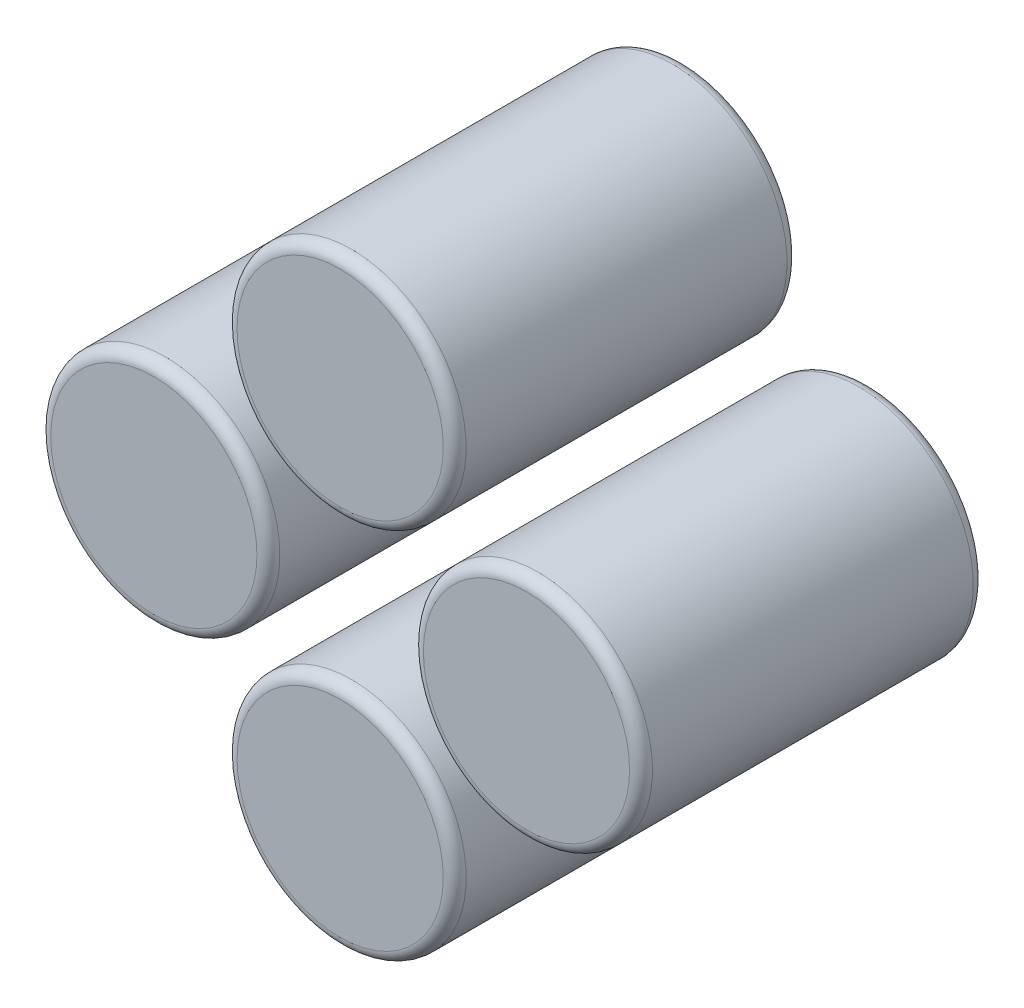
ISO-10303-21;
HEADER;
FILE_DESCRIPTION(('STEP AP214'),'2;1');
FILE_NAME('part.step','',(''),(''),'','','');
FILE_SCHEMA(('AUTOMOTIVE_DESIGN { 1 0 10303 214 1 1 1 1 }'));
ENDSEC;
DATA;
#1=APPLICATION_CONTEXT('core data for automotive mechanical design processes');
#2=APPLICATION_PROTOCOL_DEFINITION('international standard','automotive_design',2000,#1);
#3=PRODUCT_CONTEXT('',#1,'mechanical');
#4=PRODUCT('Part','Part','',(#3));
#5=PRODUCT_RELATED_PRODUCT_CATEGORY('part','',(#4));
#6=PRODUCT_DEFINITION_FORMATION('','',#4);
#7=PRODUCT_DEFINITION_CONTEXT('part definition',#1,'design');
#8=PRODUCT_DEFINITION('design','',#6,#7);
#9=PRODUCT_DEFINITION_SHAPE('','',#8);
#10=(LENGTH_UNIT() NAMED_UNIT(*) SI_UNIT(.MILLI.,.METRE.));
#11=(NAMED_UNIT(*) PLANE_ANGLE_UNIT() SI_UNIT($,.RADIAN.));
#12=(NAMED_UNIT(*) SI_UNIT($,.STERADIAN.) SOLID_ANGLE_UNIT());
#13=UNCERTAINTY_MEASURE_WITH_UNIT(LENGTH_MEASURE(1.E-05),#10,'distance_accuracy_value','');
#14=(GEOMETRIC_REPRESENTATION_CONTEXT(3) GLOBAL_UNCERTAINTY_ASSIGNED_CONTEXT((#13)) GLOBAL_UNIT_ASSIGNED_CONTEXT((#10,
#11,#12)) REPRESENTATION_CONTEXT('',''));
#15=CARTESIAN_POINT('',(0.,0.,0.));
#16=DIRECTION('',(0.,0.,1.));
#17=DIRECTION('',(1.,0.,0.));
#18=AXIS2_PLACEMENT_3D('',#15,#16,#17);
#19=CARTESIAN_POINT('',(8.13172798364529,0.,-7.49999999999999));
#20=DIRECTION('',(0.,0.,1.));
#21=DIRECTION('',(1.,0.,0.));
#22=AXIS2_PLACEMENT_3D('',#19,#20,#21);
#23=CYLINDRICAL_SURFACE('',#22,5.);
#24=CARTESIAN_POINT('',(8.13172798364529,0.,7.00000000000001));
#25=DIRECTION('',(0.,0.,-1.));
#26=DIRECTION('',(-1.,0.,0.));
#27=AXIS2_PLACEMENT_3D('',#24,#25,#26);
#28=CIRCLE('',#27,5.);
#29=CARTESIAN_POINT('',(3.1317279836453,0.,7.00000000000001));
#30=VERTEX_POINT('',#29);
#31=EDGE_CURVE('E57',#30,#30,#28,.T.);
#32=ORIENTED_EDGE('',*,*,#31,.T.);
#33=EDGE_LOOP('',(#32));
#34=FACE_BOUND('',#33,.T.);
#35=CARTESIAN_POINT('',(8.13172798364529,0.,-6.99999999999999));
#36=DIRECTION('',(0.,0.,-1.));
#37=DIRECTION('',(-1.,0.,0.));
#38=AXIS2_PLACEMENT_3D('',#35,#36,#37);
#39=CIRCLE('',#38,5.);
#40=CARTESIAN_POINT('',(3.1317279836453,0.,-6.99999999999999));
#41=VERTEX_POINT('',#40);
#42=EDGE_CURVE('E61',#41,#41,#39,.F.);
#43=ORIENTED_EDGE('',*,*,#42,.T.);
#44=EDGE_LOOP('',(#43));
#45=FACE_BOUND('',#44,.T.);
#46=ADVANCED_FACE('F46',(#34,#45),#23,.T.);
#47=CARTESIAN_POINT('',(8.13172798364529,0.,-7.49999999999999));
#48=DIRECTION('',(0.,0.,-1.));
#49=DIRECTION('',(-1.,0.,0.));
#50=AXIS2_PLACEMENT_3D('',#47,#48,#49);
#51=PLANE('',#50);
#52=CARTESIAN_POINT('',(8.13172798364529,0.,-7.49999999999999));
#53=DIRECTION('',(0.,0.,-1.));
#54=DIRECTION('',(-1.,0.,0.));
#55=AXIS2_PLACEMENT_3D('',#52,#53,#54);
#56=CIRCLE('',#55,4.5);
#57=CARTESIAN_POINT('',(3.6317279836453,0.,-7.49999999999999));
#58=VERTEX_POINT('',#57);
#59=EDGE_CURVE('E11',#58,#58,#56,.T.);
#60=ORIENTED_EDGE('',*,*,#59,.T.);
#61=EDGE_LOOP('',(#60));
#62=FACE_BOUND('',#61,.T.);
#63=ADVANCED_FACE('F77',(#62),#51,.T.);
#64=CARTESIAN_POINT('',(8.13172798364529,0.,7.50000000000001));
#65=DIRECTION('',(0.,0.,-1.));
#66=DIRECTION('',(-1.,0.,0.));
#67=AXIS2_PLACEMENT_3D('',#64,#65,#66);
#68=PLANE('',#67);
#69=CARTESIAN_POINT('',(8.13172798364529,0.,7.50000000000001));
#70=DIRECTION('',(0.,0.,-1.));
#71=DIRECTION('',(-1.,0.,0.));
#72=AXIS2_PLACEMENT_3D('',#69,#70,#71);
#73=CIRCLE('',#72,4.5);
#74=CARTESIAN_POINT('',(3.6317279836453,0.,7.50000000000001));
#75=VERTEX_POINT('',#74);
#76=EDGE_CURVE('E53',#75,#75,#73,.F.);
#77=ORIENTED_EDGE('',*,*,#76,.T.);
#78=EDGE_LOOP('',(#77));
#79=FACE_BOUND('',#78,.T.);
#80=ADVANCED_FACE('F74',(#79),#68,.F.);
#81=CARTESIAN_POINT('',(8.13172798364529,0.,7.00000000000001));
#82=DIRECTION('',(0.,0.,-1.));
#83=DIRECTION('',(-1.,0.,0.));
#84=AXIS2_PLACEMENT_3D('',#81,#82,#83);
#85=TOROIDAL_SURFACE('',#84,4.5,0.5);
#86=ORIENTED_EDGE('',*,*,#76,.F.);
#87=EDGE_LOOP('',(#86));
#88=FACE_BOUND('',#87,.T.);
#89=ORIENTED_EDGE('',*,*,#31,.F.);
#90=EDGE_LOOP('',(#89));
#91=FACE_BOUND('',#90,.T.);
#92=ADVANCED_FACE('F70',(#88,#91),#85,.T.);
#93=CARTESIAN_POINT('',(8.13172798364529,0.,-6.99999999999999));
#94=DIRECTION('',(0.,0.,-1.));
#95=DIRECTION('',(-1.,0.,0.));
#96=AXIS2_PLACEMENT_3D('',#93,#94,#95);
#97=TOROIDAL_SURFACE('',#96,4.5,0.5);
#98=ORIENTED_EDGE('',*,*,#42,.F.);
#99=EDGE_LOOP('',(#98));
#100=FACE_BOUND('',#99,.T.);
#101=ORIENTED_EDGE('',*,*,#59,.F.);
#102=EDGE_LOOP('',(#101));
#103=FACE_BOUND('',#102,.T.);
#104=ADVANCED_FACE('F48',(#100,#103),#97,.T.);
#105=CLOSED_SHELL('',(#46,#63,#80,#92,#104));
#106=MANIFOLD_SOLID_BREP('B2',#105);
#107=CARTESIAN_POINT('',(0.,8.13172798364529,-7.49999999999999));
#108=DIRECTION('',(0.,0.,1.));
#109=DIRECTION('',(1.,0.,0.));
#110=AXIS2_PLACEMENT_3D('',#107,#108,#109);
#111=CYLINDRICAL_SURFACE('',#110,5.);
#112=CARTESIAN_POINT('',(0.,8.13172798364529,7.00000000000001));
#113=DIRECTION('',(0.,0.,-1.));
#114=DIRECTION('',(-1.,0.,0.));
#115=AXIS2_PLACEMENT_3D('',#112,#113,#114);
#116=CIRCLE('',#115,5.);
#117=CARTESIAN_POINT('',(-5.,8.13172798364529,7.00000000000001));
#118=VERTEX_POINT('',#117);
#119=EDGE_CURVE('E136',#118,#118,#116,.T.);
#120=ORIENTED_EDGE('',*,*,#119,.T.);
#121=EDGE_LOOP('',(#120));
#122=FACE_BOUND('',#121,.T.);
#123=CARTESIAN_POINT('',(0.,8.13172798364529,-6.99999999999999));
#124=DIRECTION('',(0.,0.,-1.));
#125=DIRECTION('',(-1.,0.,0.));
#126=AXIS2_PLACEMENT_3D('',#123,#124,#125);
#127=CIRCLE('',#126,5.);
#128=CARTESIAN_POINT('',(-5.,8.13172798364529,-6.99999999999999));
#129=VERTEX_POINT('',#128);
#130=EDGE_CURVE('E140',#129,#129,#127,.F.);
#131=ORIENTED_EDGE('',*,*,#130,.T.);
#132=EDGE_LOOP('',(#131));
#133=FACE_BOUND('',#132,.T.);
#134=ADVANCED_FACE('F125',(#122,#133),#111,.T.);
#135=CARTESIAN_POINT('',(0.,8.13172798364529,-7.49999999999999));
#136=DIRECTION('',(0.,0.,-1.));
#137=DIRECTION('',(-1.,0.,0.));
#138=AXIS2_PLACEMENT_3D('',#135,#136,#137);
#139=PLANE('',#138);
#140=CARTESIAN_POINT('',(0.,8.13172798364529,-7.49999999999999));
#141=DIRECTION('',(0.,0.,-1.));
#142=DIRECTION('',(-1.,0.,0.));
#143=AXIS2_PLACEMENT_3D('',#140,#141,#142);
#144=CIRCLE('',#143,4.5);
#145=CARTESIAN_POINT('',(-4.5,8.13172798364529,-7.49999999999999));
#146=VERTEX_POINT('',#145);
#147=EDGE_CURVE('E45',#146,#146,#144,.T.);
#148=ORIENTED_EDGE('',*,*,#147,.T.);
#149=EDGE_LOOP('',(#148));
#150=FACE_BOUND('',#149,.T.);
#151=ADVANCED_FACE('F156',(#150),#139,.T.);
#152=CARTESIAN_POINT('',(0.,8.13172798364529,7.50000000000001));
#153=DIRECTION('',(0.,0.,-1.));
#154=DIRECTION('',(-1.,0.,0.));
#155=AXIS2_PLACEMENT_3D('',#152,#153,#154);
#156=PLANE('',#155);
#157=CARTESIAN_POINT('',(0.,8.13172798364529,7.50000000000001));
#158=DIRECTION('',(0.,0.,-1.));
#159=DIRECTION('',(-1.,0.,0.));
#160=AXIS2_PLACEMENT_3D('',#157,#158,#159);
#161=CIRCLE('',#160,4.5);
#162=CARTESIAN_POINT('',(-4.5,8.13172798364529,7.50000000000001));
#163=VERTEX_POINT('',#162);
#164=EDGE_CURVE('E132',#163,#163,#161,.F.);
#165=ORIENTED_EDGE('',*,*,#164,.T.);
#166=EDGE_LOOP('',(#165));
#167=FACE_BOUND('',#166,.T.);
#168=ADVANCED_FACE('F153',(#167),#156,.F.);
#169=CARTESIAN_POINT('',(0.,8.13172798364529,7.00000000000001));
#170=DIRECTION('',(0.,0.,-1.));
#171=DIRECTION('',(-1.,0.,0.));
#172=AXIS2_PLACEMENT_3D('',#169,#170,#171);
#173=TOROIDAL_SURFACE('',#172,4.5,0.5);
#174=ORIENTED_EDGE('',*,*,#164,.F.);
#175=EDGE_LOOP('',(#174));
#176=FACE_BOUND('',#175,.T.);
#177=ORIENTED_EDGE('',*,*,#119,.F.);
#178=EDGE_LOOP('',(#177));
#179=FACE_BOUND('',#178,.T.);
#180=ADVANCED_FACE('F149',(#176,#179),#173,.T.);
#181=CARTESIAN_POINT('',(0.,8.13172798364529,-6.99999999999999));
#182=DIRECTION('',(0.,0.,-1.));
#183=DIRECTION('',(-1.,0.,0.));
#184=AXIS2_PLACEMENT_3D('',#181,#182,#183);
#185=TOROIDAL_SURFACE('',#184,4.5,0.5);
#186=ORIENTED_EDGE('',*,*,#130,.F.);
#187=EDGE_LOOP('',(#186));
#188=FACE_BOUND('',#187,.T.);
#189=ORIENTED_EDGE('',*,*,#147,.F.);
#190=EDGE_LOOP('',(#189));
#191=FACE_BOUND('',#190,.T.);
#192=ADVANCED_FACE('F127',(#188,#191),#185,.T.);
#193=CLOSED_SHELL('',(#134,#151,#168,#180,#192));
#194=MANIFOLD_SOLID_BREP('B6',#193);
#195=CARTESIAN_POINT('',(0.,-8.13172798364529,-7.49999999999999));
#196=DIRECTION('',(0.,0.,1.));
#197=DIRECTION('',(1.,0.,0.));
#198=AXIS2_PLACEMENT_3D('',#195,#196,#197);
#199=CYLINDRICAL_SURFACE('',#198,5.);
#200=CARTESIAN_POINT('',(0.,-8.13172798364529,7.00000000000001));
#201=DIRECTION('',(0.,0.,-1.));
#202=DIRECTION('',(-1.,0.,0.));
#203=AXIS2_PLACEMENT_3D('',#200,#201,#202);
#204=CIRCLE('',#203,5.);
#205=CARTESIAN_POINT('',(-4.99999999999999,-8.13172798364529,7.00000000000001));
#206=VERTEX_POINT('',#205);
#207=EDGE_CURVE('E214',#206,#206,#204,.T.);
#208=ORIENTED_EDGE('',*,*,#207,.T.);
#209=EDGE_LOOP('',(#208));
#210=FACE_BOUND('',#209,.T.);
#211=CARTESIAN_POINT('',(0.,-8.13172798364529,-6.99999999999999));
#212=DIRECTION('',(0.,0.,-1.));
#213=DIRECTION('',(-1.,0.,0.));
#214=AXIS2_PLACEMENT_3D('',#211,#212,#213);
#215=CIRCLE('',#214,5.);
#216=CARTESIAN_POINT('',(-4.99999999999999,-8.13172798364529,-6.99999999999999));
#217=VERTEX_POINT('',#216);
#218=EDGE_CURVE('E218',#217,#217,#215,.F.);
#219=ORIENTED_EDGE('',*,*,#218,.T.);
#220=EDGE_LOOP('',(#219));
#221=FACE_BOUND('',#220,.T.);
#222=ADVANCED_FACE('F203',(#210,#221),#199,.T.);
#223=CARTESIAN_POINT('',(0.,-8.13172798364529,-7.49999999999999));
#224=DIRECTION('',(0.,0.,-1.));
#225=DIRECTION('',(-1.,0.,0.));
#226=AXIS2_PLACEMENT_3D('',#223,#224,#225);
#227=PLANE('',#226);
#228=CARTESIAN_POINT('',(0.,-8.13172798364529,-7.49999999999999));
#229=DIRECTION('',(0.,0.,-1.));
#230=DIRECTION('',(-1.,0.,0.));
#231=AXIS2_PLACEMENT_3D('',#228,#229,#230);
#232=CIRCLE('',#231,4.5);
#233=CARTESIAN_POINT('',(-4.49999999999999,-8.13172798364529,-7.49999999999999));
#234=VERTEX_POINT('',#233);
#235=EDGE_CURVE('E124',#234,#234,#232,.T.);
#236=ORIENTED_EDGE('',*,*,#235,.T.);
#237=EDGE_LOOP('',(#236));
#238=FACE_BOUND('',#237,.T.);
#239=ADVANCED_FACE('F234',(#238),#227,.T.);
#240=CARTESIAN_POINT('',(0.,-8.13172798364529,7.50000000000001));
#241=DIRECTION('',(0.,0.,-1.));
#242=DIRECTION('',(-1.,0.,0.));
#243=AXIS2_PLACEMENT_3D('',#240,#241,#242);
#244=PLANE('',#243);
#245=CARTESIAN_POINT('',(0.,-8.13172798364529,7.50000000000001));
#246=DIRECTION('',(0.,0.,-1.));
#247=DIRECTION('',(-1.,0.,0.));
#248=AXIS2_PLACEMENT_3D('',#245,#246,#247);
#249=CIRCLE('',#248,4.5);
#250=CARTESIAN_POINT('',(-4.49999999999999,-8.13172798364529,7.50000000000001));
#251=VERTEX_POINT('',#250);
#252=EDGE_CURVE('E210',#251,#251,#249,.F.);
#253=ORIENTED_EDGE('',*,*,#252,.T.);
#254=EDGE_LOOP('',(#253));
#255=FACE_BOUND('',#254,.T.);
#256=ADVANCED_FACE('F231',(#255),#244,.F.);
#257=CARTESIAN_POINT('',(0.,-8.13172798364529,7.00000000000001));
#258=DIRECTION('',(0.,0.,-1.));
#259=DIRECTION('',(-1.,0.,0.));
#260=AXIS2_PLACEMENT_3D('',#257,#258,#259);
#261=TOROIDAL_SURFACE('',#260,4.5,0.5);
#262=ORIENTED_EDGE('',*,*,#252,.F.);
#263=EDGE_LOOP('',(#262));
#264=FACE_BOUND('',#263,.T.);
#265=ORIENTED_EDGE('',*,*,#207,.F.);
#266=EDGE_LOOP('',(#265));
#267=FACE_BOUND('',#266,.T.);
#268=ADVANCED_FACE('F227',(#264,#267),#261,.T.);
#269=CARTESIAN_POINT('',(0.,-8.13172798364529,-6.99999999999999));
#270=DIRECTION('',(0.,0.,-1.));
#271=DIRECTION('',(-1.,0.,0.));
#272=AXIS2_PLACEMENT_3D('',#269,#270,#271);
#273=TOROIDAL_SURFACE('',#272,4.5,0.5);
#274=ORIENTED_EDGE('',*,*,#218,.F.);
#275=EDGE_LOOP('',(#274));
#276=FACE_BOUND('',#275,.T.);
#277=ORIENTED_EDGE('',*,*,#235,.F.);
#278=EDGE_LOOP('',(#277));
#279=FACE_BOUND('',#278,.T.);
#280=ADVANCED_FACE('F205',(#276,#279),#273,.T.);
#281=CLOSED_SHELL('',(#222,#239,#256,#268,#280));
#282=MANIFOLD_SOLID_BREP('B40',#281);
#283=CARTESIAN_POINT('',(-8.13172798364529,0.,-7.49999999999999));
#284=DIRECTION('',(0.,0.,1.));
#285=DIRECTION('',(1.,0.,0.));
#286=AXIS2_PLACEMENT_3D('',#283,#284,#285);
#287=CYLINDRICAL_SURFACE('',#286,5.);
#288=CARTESIAN_POINT('',(-8.13172798364529,0.,7.00000000000001));
#289=DIRECTION('',(0.,0.,-1.));
#290=DIRECTION('',(-1.,0.,0.));
#291=AXIS2_PLACEMENT_3D('',#288,#289,#290);
#292=CIRCLE('',#291,5.);
#293=CARTESIAN_POINT('',(-13.1317279836453,0.,7.00000000000001));
#294=VERTEX_POINT('',#293);
#295=EDGE_CURVE('E285',#294,#294,#292,.T.);
#296=ORIENTED_EDGE('',*,*,#295,.T.);
#297=EDGE_LOOP('',(#296));
#298=FACE_BOUND('',#297,.T.);
#299=CARTESIAN_POINT('',(-8.13172798364529,0.,-6.99999999999999));
#300=DIRECTION('',(0.,0.,-1.));
#301=DIRECTION('',(-1.,0.,0.));
#302=AXIS2_PLACEMENT_3D('',#299,#300,#301);
#303=CIRCLE('',#302,5.);
#304=CARTESIAN_POINT('',(-13.1317279836453,0.,-6.99999999999999));
#305=VERTEX_POINT('',#304);
#306=EDGE_CURVE('E289',#305,#305,#303,.F.);
#307=ORIENTED_EDGE('',*,*,#306,.T.);
#308=EDGE_LOOP('',(#307));
#309=FACE_BOUND('',#308,.T.);
#310=ADVANCED_FACE('F274',(#298,#309),#287,.T.);
#311=CARTESIAN_POINT('',(-8.13172798364529,0.,-7.49999999999999));
#312=DIRECTION('',(0.,0.,-1.));
#313=DIRECTION('',(-1.,0.,0.));
#314=AXIS2_PLACEMENT_3D('',#311,#312,#313);
#315=PLANE('',#314);
#316=CARTESIAN_POINT('',(-8.13172798364529,0.,-7.49999999999999));
#317=DIRECTION('',(0.,0.,-1.));
#318=DIRECTION('',(-1.,0.,0.));
#319=AXIS2_PLACEMENT_3D('',#316,#317,#318);
#320=CIRCLE('',#319,4.5);
#321=CARTESIAN_POINT('',(-12.6317279836453,0.,-7.49999999999999));
#322=VERTEX_POINT('',#321);
#323=EDGE_CURVE('E202',#322,#322,#320,.T.);
#324=ORIENTED_EDGE('',*,*,#323,.T.);
#325=EDGE_LOOP('',(#324));
#326=FACE_BOUND('',#325,.T.);
#327=ADVANCED_FACE('F305',(#326),#315,.T.);
#328=CARTESIAN_POINT('',(-8.13172798364529,0.,7.50000000000001));
#329=DIRECTION('',(0.,0.,-1.));
#330=DIRECTION('',(-1.,0.,0.));
#331=AXIS2_PLACEMENT_3D('',#328,#329,#330);
#332=PLANE('',#331);
#333=CARTESIAN_POINT('',(-8.13172798364529,0.,7.50000000000001));
#334=DIRECTION('',(0.,0.,-1.));
#335=DIRECTION('',(-1.,0.,0.));
#336=AXIS2_PLACEMENT_3D('',#333,#334,#335);
#337=CIRCLE('',#336,4.5);
#338=CARTESIAN_POINT('',(-12.6317279836453,0.,7.50000000000001));
#339=VERTEX_POINT('',#338);
#340=EDGE_CURVE('E281',#339,#339,#337,.F.);
#341=ORIENTED_EDGE('',*,*,#340,.T.);
#342=EDGE_LOOP('',(#341));
#343=FACE_BOUND('',#342,.T.);
#344=ADVANCED_FACE('F302',(#343),#332,.F.);
#345=CARTESIAN_POINT('',(-8.13172798364529,0.,7.00000000000001));
#346=DIRECTION('',(0.,0.,-1.));
#347=DIRECTION('',(-1.,0.,0.));
#348=AXIS2_PLACEMENT_3D('',#345,#346,#347);
#349=TOROIDAL_SURFACE('',#348,4.5,0.5);
#350=ORIENTED_EDGE('',*,*,#340,.F.);
#351=EDGE_LOOP('',(#350));
#352=FACE_BOUND('',#351,.T.);
#353=ORIENTED_EDGE('',*,*,#295,.F.);
#354=EDGE_LOOP('',(#353));
#355=FACE_BOUND('',#354,.T.);
#356=ADVANCED_FACE('F298',(#352,#355),#349,.T.);
#357=CARTESIAN_POINT('',(-8.13172798364529,0.,-6.99999999999999));
#358=DIRECTION('',(0.,0.,-1.));
#359=DIRECTION('',(-1.,0.,0.));
#360=AXIS2_PLACEMENT_3D('',#357,#358,#359);
#361=TOROIDAL_SURFACE('',#360,4.5,0.5);
#362=ORIENTED_EDGE('',*,*,#306,.F.);
#363=EDGE_LOOP('',(#362));
#364=FACE_BOUND('',#363,.T.);
#365=ORIENTED_EDGE('',*,*,#323,.F.);
#366=EDGE_LOOP('',(#365));
#367=FACE_BOUND('',#366,.T.);
#368=ADVANCED_FACE('F276',(#364,#367),#361,.T.);
#369=CLOSED_SHELL('',(#310,#327,#344,#356,#368));
#370=MANIFOLD_SOLID_BREP('B119',#369);
#371=ADVANCED_BREP_SHAPE_REPRESENTATION('',(#18,#106,#194,#282,#370),#14);
#372=SHAPE_DEFINITION_REPRESENTATION(#9,#371);
ENDSEC;
END-ISO-10303-21;
